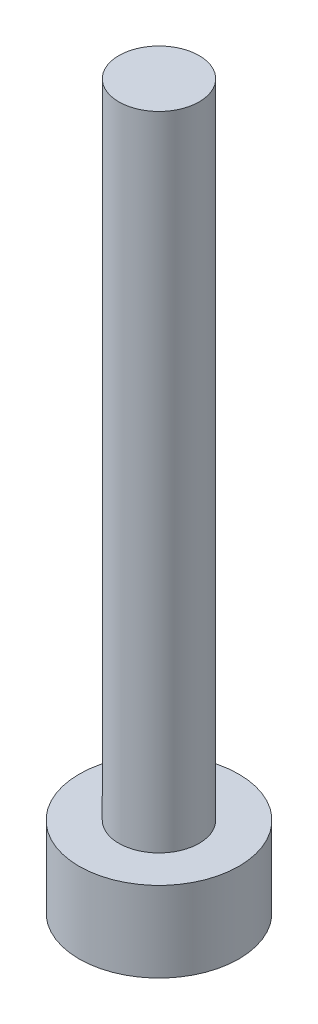
ISO-10303-21;
HEADER;
FILE_DESCRIPTION(('STEP AP214'),'2;1');
FILE_NAME('part.step','',(''),(''),'','','');
FILE_SCHEMA(('AUTOMOTIVE_DESIGN { 1 0 10303 214 1 1 1 1 }'));
ENDSEC;
DATA;
#1=APPLICATION_CONTEXT('core data for automotive mechanical design processes');
#2=APPLICATION_PROTOCOL_DEFINITION('international standard','automotive_design',2000,#1);
#3=PRODUCT_CONTEXT('',#1,'mechanical');
#4=PRODUCT('Part','Part','',(#3));
#5=PRODUCT_RELATED_PRODUCT_CATEGORY('part','',(#4));
#6=PRODUCT_DEFINITION_FORMATION('','',#4);
#7=PRODUCT_DEFINITION_CONTEXT('part definition',#1,'design');
#8=PRODUCT_DEFINITION('design','',#6,#7);
#9=PRODUCT_DEFINITION_SHAPE('','',#8);
#10=(LENGTH_UNIT() NAMED_UNIT(*) SI_UNIT(.MILLI.,.METRE.));
#11=(NAMED_UNIT(*) PLANE_ANGLE_UNIT() SI_UNIT($,.RADIAN.));
#12=(NAMED_UNIT(*) SI_UNIT($,.STERADIAN.) SOLID_ANGLE_UNIT());
#13=UNCERTAINTY_MEASURE_WITH_UNIT(LENGTH_MEASURE(1.E-05),#10,'distance_accuracy_value','');
#14=(GEOMETRIC_REPRESENTATION_CONTEXT(3) GLOBAL_UNCERTAINTY_ASSIGNED_CONTEXT((#13)) GLOBAL_UNIT_ASSIGNED_CONTEXT((#10,
#11,#12)) REPRESENTATION_CONTEXT('',''));
#15=CARTESIAN_POINT('',(0.,0.,0.));
#16=DIRECTION('',(0.,0.,1.));
#17=DIRECTION('',(1.,0.,0.));
#18=AXIS2_PLACEMENT_3D('',#15,#16,#17);
#19=CARTESIAN_POINT('',(0.,16.,0.));
#20=DIRECTION('',(0.,-1.,0.));
#21=DIRECTION('',(0.,0.,-1.));
#22=AXIS2_PLACEMENT_3D('',#19,#20,#21);
#23=CYLINDRICAL_SURFACE('',#22,1.);
#24=CARTESIAN_POINT('',(0.,16.,0.));
#25=DIRECTION('',(0.,1.,0.));
#26=DIRECTION('',(0.,0.,1.));
#27=AXIS2_PLACEMENT_3D('',#24,#25,#26);
#28=CIRCLE('',#27,1.);
#29=CARTESIAN_POINT('',(0.,16.,1.));
#30=VERTEX_POINT('',#29);
#31=EDGE_CURVE('E10',#30,#30,#28,.T.);
#32=ORIENTED_EDGE('',*,*,#31,.F.);
#33=EDGE_LOOP('',(#32));
#34=FACE_BOUND('',#33,.T.);
#35=CARTESIAN_POINT('',(0.,0.,0.));
#36=DIRECTION('',(0.,-1.,0.));
#37=DIRECTION('',(0.,0.,-1.));
#38=AXIS2_PLACEMENT_3D('',#35,#36,#37);
#39=CIRCLE('',#38,1.);
#40=CARTESIAN_POINT('',(0.,0.,-1.));
#41=VERTEX_POINT('',#40);
#42=EDGE_CURVE('E37',#41,#41,#39,.T.);
#43=ORIENTED_EDGE('',*,*,#42,.F.);
#44=EDGE_LOOP('',(#43));
#45=FACE_BOUND('',#44,.T.);
#46=ADVANCED_FACE('F31',(#34,#45),#23,.T.);
#47=CARTESIAN_POINT('',(0.,16.,0.));
#48=DIRECTION('',(0.,1.,0.));
#49=DIRECTION('',(0.,0.,1.));
#50=AXIS2_PLACEMENT_3D('',#47,#48,#49);
#51=PLANE('',#50);
#52=ORIENTED_EDGE('',*,*,#31,.T.);
#53=EDGE_LOOP('',(#52));
#54=FACE_BOUND('',#53,.T.);
#55=ADVANCED_FACE('F64',(#54),#51,.T.);
#56=CARTESIAN_POINT('',(0.,-2.,0.));
#57=DIRECTION('',(0.,1.,0.));
#58=DIRECTION('',(0.,0.,1.));
#59=AXIS2_PLACEMENT_3D('',#56,#57,#58);
#60=CYLINDRICAL_SURFACE('',#59,1.99);
#61=CARTESIAN_POINT('',(0.,-2.,0.));
#62=DIRECTION('',(0.,-1.,0.));
#63=DIRECTION('',(0.,0.,-1.));
#64=AXIS2_PLACEMENT_3D('',#61,#62,#63);
#65=CIRCLE('',#64,1.99);
#66=CARTESIAN_POINT('',(0.,-2.,-1.99));
#67=VERTEX_POINT('',#66);
#68=EDGE_CURVE('E41',#67,#67,#65,.T.);
#69=ORIENTED_EDGE('',*,*,#68,.F.);
#70=EDGE_LOOP('',(#69));
#71=FACE_BOUND('',#70,.T.);
#72=CARTESIAN_POINT('',(0.,0.,0.));
#73=DIRECTION('',(0.,-1.,0.));
#74=DIRECTION('',(0.,0.,-1.));
#75=AXIS2_PLACEMENT_3D('',#72,#73,#74);
#76=CIRCLE('',#75,1.99);
#77=CARTESIAN_POINT('',(0.,0.,-1.99));
#78=VERTEX_POINT('',#77);
#79=EDGE_CURVE('E45',#78,#78,#76,.T.);
#80=ORIENTED_EDGE('',*,*,#79,.T.);
#81=EDGE_LOOP('',(#80));
#82=FACE_BOUND('',#81,.T.);
#83=ADVANCED_FACE('F51',(#71,#82),#60,.T.);
#84=CARTESIAN_POINT('',(0.,-2.,0.));
#85=DIRECTION('',(0.,-1.,0.));
#86=DIRECTION('',(0.,0.,-1.));
#87=AXIS2_PLACEMENT_3D('',#84,#85,#86);
#88=PLANE('',#87);
#89=ORIENTED_EDGE('',*,*,#68,.T.);
#90=EDGE_LOOP('',(#89));
#91=FACE_BOUND('',#90,.T.);
#92=ADVANCED_FACE('F55',(#91),#88,.T.);
#93=CARTESIAN_POINT('',(0.,0.,0.));
#94=DIRECTION('',(0.,-1.,0.));
#95=DIRECTION('',(0.,0.,-1.));
#96=AXIS2_PLACEMENT_3D('',#93,#94,#95);
#97=PLANE('',#96);
#98=ORIENTED_EDGE('',*,*,#42,.T.);
#99=EDGE_LOOP('',(#98));
#100=FACE_BOUND('',#99,.T.);
#101=ORIENTED_EDGE('',*,*,#79,.F.);
#102=EDGE_LOOP('',(#101));
#103=FACE_BOUND('',#102,.T.);
#104=ADVANCED_FACE('F53',(#100,#103),#97,.F.);
#105=CLOSED_SHELL('',(#46,#55,#83,#92,#104));
#106=MANIFOLD_SOLID_BREP('B2',#105);
#107=ADVANCED_BREP_SHAPE_REPRESENTATION('',(#18,#106),#14);
#108=SHAPE_DEFINITION_REPRESENTATION(#9,#107);
ENDSEC;
END-ISO-10303-21;
